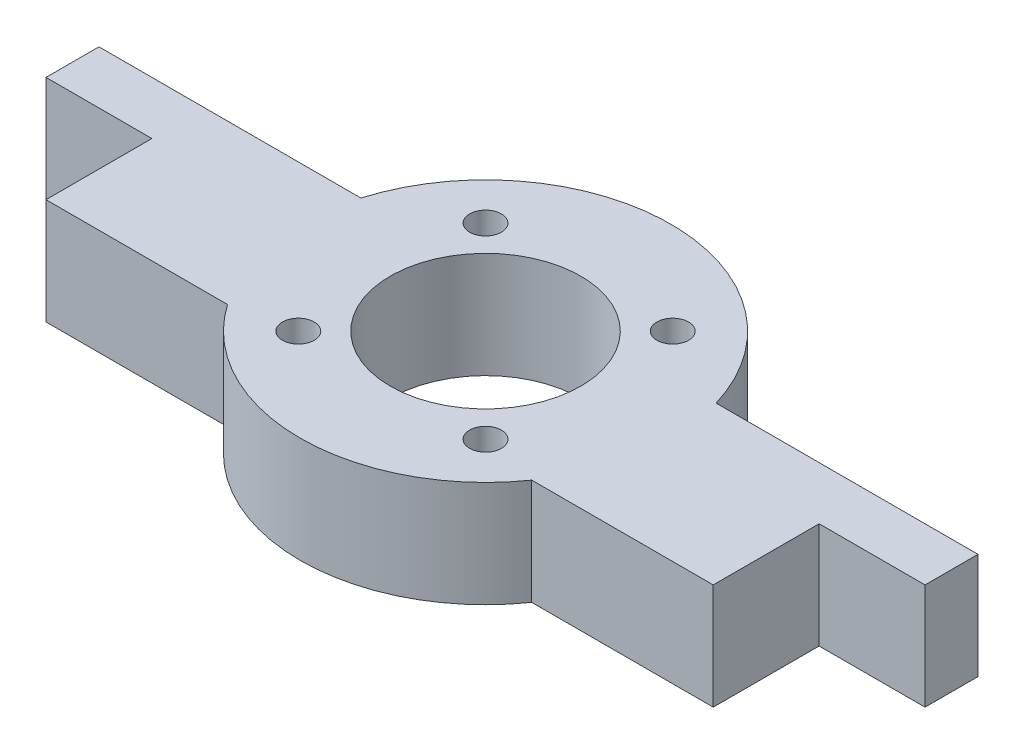
ISO-10303-21;
HEADER;
FILE_DESCRIPTION(('STEP AP214'),'2;1');
FILE_NAME('part.step','',(''),(''),'','','');
FILE_SCHEMA(('AUTOMOTIVE_DESIGN { 1 0 10303 214 1 1 1 1 }'));
ENDSEC;
DATA;
#1=APPLICATION_CONTEXT('core data for automotive mechanical design processes');
#2=APPLICATION_PROTOCOL_DEFINITION('international standard','automotive_design',2000,#1);
#3=PRODUCT_CONTEXT('',#1,'mechanical');
#4=PRODUCT('Part','Part','',(#3));
#5=PRODUCT_RELATED_PRODUCT_CATEGORY('part','',(#4));
#6=PRODUCT_DEFINITION_FORMATION('','',#4);
#7=PRODUCT_DEFINITION_CONTEXT('part definition',#1,'design');
#8=PRODUCT_DEFINITION('design','',#6,#7);
#9=PRODUCT_DEFINITION_SHAPE('','',#8);
#10=(LENGTH_UNIT() NAMED_UNIT(*) SI_UNIT(.MILLI.,.METRE.));
#11=(NAMED_UNIT(*) PLANE_ANGLE_UNIT() SI_UNIT($,.RADIAN.));
#12=(NAMED_UNIT(*) SI_UNIT($,.STERADIAN.) SOLID_ANGLE_UNIT());
#13=UNCERTAINTY_MEASURE_WITH_UNIT(LENGTH_MEASURE(1.E-05),#10,'distance_accuracy_value','');
#14=(GEOMETRIC_REPRESENTATION_CONTEXT(3) GLOBAL_UNCERTAINTY_ASSIGNED_CONTEXT((#13)) GLOBAL_UNIT_ASSIGNED_CONTEXT((#10,
#11,#12)) REPRESENTATION_CONTEXT('',''));
#15=CARTESIAN_POINT('',(0.,0.,0.));
#16=DIRECTION('',(0.,0.,1.));
#17=DIRECTION('',(1.,0.,0.));
#18=AXIS2_PLACEMENT_3D('',#15,#16,#17);
#19=CARTESIAN_POINT('',(0.,10.,0.));
#20=DIRECTION('',(0.,1.,0.));
#21=DIRECTION('',(0.,0.,1.));
#22=AXIS2_PLACEMENT_3D('',#19,#20,#21);
#23=PLANE('',#22);
#24=CARTESIAN_POINT('',(8.83883476483184,10.,8.83883476483184));
#25=DIRECTION('',(0.,1.,0.));
#26=DIRECTION('',(0.,0.,1.));
#27=AXIS2_PLACEMENT_3D('',#24,#25,#26);
#28=CIRCLE('',#27,1.5);
#29=CARTESIAN_POINT('',(8.83883476483184,10.,10.3388347648318));
#30=VERTEX_POINT('',#29);
#31=EDGE_CURVE('E340',#30,#30,#28,.T.);
#32=ORIENTED_EDGE('',*,*,#31,.F.);
#33=EDGE_LOOP('',(#32));
#34=FACE_BOUND('',#33,.T.);
#35=CARTESIAN_POINT('',(-8.83883476483184,10.,-8.83883476483184));
#36=DIRECTION('',(0.,1.,0.));
#37=DIRECTION('',(0.,0.,1.));
#38=AXIS2_PLACEMENT_3D('',#35,#36,#37);
#39=CIRCLE('',#38,1.5);
#40=CARTESIAN_POINT('',(-8.83883476483184,10.,-7.33883476483184));
#41=VERTEX_POINT('',#40);
#42=EDGE_CURVE('E356',#41,#41,#39,.T.);
#43=ORIENTED_EDGE('',*,*,#42,.F.);
#44=EDGE_LOOP('',(#43));
#45=FACE_BOUND('',#44,.T.);
#46=DIRECTION('',(1.,0.,0.));
#47=VECTOR('',#46,1.);
#48=CARTESIAN_POINT('',(-41.5,10.,0.));
#49=LINE('',#48,#47);
#50=CARTESIAN_POINT('',(-41.5,10.,0.));
#51=VERTEX_POINT('',#50);
#52=CARTESIAN_POINT('',(-31.5,10.,0.));
#53=VERTEX_POINT('',#52);
#54=EDGE_CURVE('E204',#51,#53,#49,.T.);
#55=ORIENTED_EDGE('',*,*,#54,.T.);
#56=DIRECTION('',(0.,0.,1.));
#57=VECTOR('',#56,1.);
#58=CARTESIAN_POINT('',(-31.5,10.,0.));
#59=LINE('',#58,#57);
#60=CARTESIAN_POINT('',(-31.5,10.,10.));
#61=VERTEX_POINT('',#60);
#62=EDGE_CURVE('E116',#53,#61,#59,.T.);
#63=ORIENTED_EDGE('',*,*,#62,.T.);
#64=DIRECTION('',(1.,0.,0.));
#65=VECTOR('',#64,1.);
#66=CARTESIAN_POINT('',(-31.5,10.,10.));
#67=LINE('',#66,#65);
#68=CARTESIAN_POINT('',(-14.3614066163451,10.,10.));
#69=VERTEX_POINT('',#68);
#70=EDGE_CURVE('E241',#61,#69,#67,.T.);
#71=ORIENTED_EDGE('',*,*,#70,.T.);
#72=CARTESIAN_POINT('',(0.,10.,0.));
#73=DIRECTION('',(0.,1.,0.));
#74=DIRECTION('',(0.,0.,1.));
#75=AXIS2_PLACEMENT_3D('',#72,#73,#74);
#76=CIRCLE('',#75,17.5);
#77=CARTESIAN_POINT('',(14.3614066163451,10.,10.));
#78=VERTEX_POINT('',#77);
#79=EDGE_CURVE('E261',#69,#78,#76,.T.);
#80=ORIENTED_EDGE('',*,*,#79,.T.);
#81=DIRECTION('',(1.,0.,0.));
#82=VECTOR('',#81,1.);
#83=CARTESIAN_POINT('',(14.3614066163451,10.,10.));
#84=LINE('',#83,#82);
#85=CARTESIAN_POINT('',(31.5,10.,10.));
#86=VERTEX_POINT('',#85);
#87=EDGE_CURVE('E257',#78,#86,#84,.T.);
#88=ORIENTED_EDGE('',*,*,#87,.T.);
#89=DIRECTION('',(0.,0.,-1.));
#90=VECTOR('',#89,1.);
#91=CARTESIAN_POINT('',(31.5,10.,0.));
#92=LINE('',#91,#90);
#93=CARTESIAN_POINT('',(31.5,10.,0.));
#94=VERTEX_POINT('',#93);
#95=EDGE_CURVE('E260',#86,#94,#92,.T.);
#96=ORIENTED_EDGE('',*,*,#95,.T.);
#97=DIRECTION('',(1.,0.,0.));
#98=VECTOR('',#97,1.);
#99=CARTESIAN_POINT('',(41.5,10.,0.));
#100=LINE('',#99,#98);
#101=CARTESIAN_POINT('',(41.5,10.,0.));
#102=VERTEX_POINT('',#101);
#103=EDGE_CURVE('E265',#94,#102,#100,.T.);
#104=ORIENTED_EDGE('',*,*,#103,.T.);
#105=DIRECTION('',(0.,0.,-1.));
#106=VECTOR('',#105,1.);
#107=CARTESIAN_POINT('',(41.5,10.,-5.));
#108=LINE('',#107,#106);
#109=CARTESIAN_POINT('',(41.5,10.,-5.));
#110=VERTEX_POINT('',#109);
#111=EDGE_CURVE('E272',#102,#110,#108,.T.);
#112=ORIENTED_EDGE('',*,*,#111,.T.);
#113=DIRECTION('',(-1.,0.,0.));
#114=VECTOR('',#113,1.);
#115=CARTESIAN_POINT('',(16.7705098312484,10.,-5.));
#116=LINE('',#115,#114);
#117=CARTESIAN_POINT('',(16.7705098312484,10.,-5.));
#118=VERTEX_POINT('',#117);
#119=EDGE_CURVE('E147',#110,#118,#116,.T.);
#120=ORIENTED_EDGE('',*,*,#119,.T.);
#121=CARTESIAN_POINT('',(0.,10.,0.));
#122=DIRECTION('',(0.,1.,0.));
#123=DIRECTION('',(0.,0.,1.));
#124=AXIS2_PLACEMENT_3D('',#121,#122,#123);
#125=CIRCLE('',#124,17.5);
#126=CARTESIAN_POINT('',(-16.7705098312484,10.,-5.00000000000001));
#127=VERTEX_POINT('',#126);
#128=EDGE_CURVE('E141',#118,#127,#125,.T.);
#129=ORIENTED_EDGE('',*,*,#128,.T.);
#130=DIRECTION('',(-1.,0.,0.));
#131=VECTOR('',#130,1.);
#132=CARTESIAN_POINT('',(-41.5,10.,-5.));
#133=LINE('',#132,#131);
#134=CARTESIAN_POINT('',(-41.5,10.,-5.));
#135=VERTEX_POINT('',#134);
#136=EDGE_CURVE('E145',#127,#135,#133,.T.);
#137=ORIENTED_EDGE('',*,*,#136,.T.);
#138=DIRECTION('',(0.,0.,1.));
#139=VECTOR('',#138,1.);
#140=CARTESIAN_POINT('',(-41.5,10.,-5.));
#141=LINE('',#140,#139);
#142=EDGE_CURVE('E61',#135,#51,#141,.T.);
#143=ORIENTED_EDGE('',*,*,#142,.T.);
#144=EDGE_LOOP('',(#55,#63,#71,#80,#88,#96,#104,#112,#120,#129,#137,#143));
#145=FACE_BOUND('',#144,.T.);
#146=CARTESIAN_POINT('',(0.,10.,0.));
#147=DIRECTION('',(0.,1.,0.));
#148=DIRECTION('',(0.,0.,1.));
#149=AXIS2_PLACEMENT_3D('',#146,#147,#148);
#150=CIRCLE('',#149,9.);
#151=CARTESIAN_POINT('',(0.,10.,9.));
#152=VERTEX_POINT('',#151);
#153=EDGE_CURVE('E174',#152,#152,#150,.T.);
#154=ORIENTED_EDGE('',*,*,#153,.F.);
#155=EDGE_LOOP('',(#154));
#156=FACE_BOUND('',#155,.T.);
#157=CARTESIAN_POINT('',(8.83883476483184,10.,-8.83883476483185));
#158=DIRECTION('',(0.,1.,0.));
#159=DIRECTION('',(0.,0.,1.));
#160=AXIS2_PLACEMENT_3D('',#157,#158,#159);
#161=CIRCLE('',#160,1.5);
#162=CARTESIAN_POINT('',(8.83883476483184,10.,-7.33883476483185));
#163=VERTEX_POINT('',#162);
#164=EDGE_CURVE('E348',#163,#163,#161,.T.);
#165=ORIENTED_EDGE('',*,*,#164,.F.);
#166=EDGE_LOOP('',(#165));
#167=FACE_BOUND('',#166,.T.);
#168=CARTESIAN_POINT('',(-8.83883476483184,10.,8.83883476483185));
#169=DIRECTION('',(0.,1.,0.));
#170=DIRECTION('',(0.,0.,1.));
#171=AXIS2_PLACEMENT_3D('',#168,#169,#170);
#172=CIRCLE('',#171,1.5);
#173=CARTESIAN_POINT('',(-8.83883476483184,10.,10.3388347648318));
#174=VERTEX_POINT('',#173);
#175=EDGE_CURVE('E329',#174,#174,#172,.T.);
#176=ORIENTED_EDGE('',*,*,#175,.F.);
#177=EDGE_LOOP('',(#176));
#178=FACE_BOUND('',#177,.T.);
#179=ADVANCED_FACE('F43',(#34,#45,#145,#156,#167,#178),#23,.T.);
#180=CARTESIAN_POINT('',(0.,0.,0.));
#181=DIRECTION('',(0.,1.,0.));
#182=DIRECTION('',(0.,0.,1.));
#183=AXIS2_PLACEMENT_3D('',#180,#181,#182);
#184=PLANE('',#183);
#185=DIRECTION('',(1.,0.,0.));
#186=VECTOR('',#185,1.);
#187=CARTESIAN_POINT('',(-41.5,0.,0.));
#188=LINE('',#187,#186);
#189=CARTESIAN_POINT('',(-41.5,0.,0.));
#190=VERTEX_POINT('',#189);
#191=CARTESIAN_POINT('',(-31.5,0.,0.));
#192=VERTEX_POINT('',#191);
#193=EDGE_CURVE('E169',#190,#192,#188,.T.);
#194=ORIENTED_EDGE('',*,*,#193,.F.);
#195=DIRECTION('',(0.,0.,1.));
#196=VECTOR('',#195,1.);
#197=CARTESIAN_POINT('',(-41.5,0.,-5.));
#198=LINE('',#197,#196);
#199=CARTESIAN_POINT('',(-41.5,0.,-5.));
#200=VERTEX_POINT('',#199);
#201=EDGE_CURVE('E108',#200,#190,#198,.T.);
#202=ORIENTED_EDGE('',*,*,#201,.F.);
#203=DIRECTION('',(-1.,0.,0.));
#204=VECTOR('',#203,1.);
#205=CARTESIAN_POINT('',(-41.5,0.,-5.));
#206=LINE('',#205,#204);
#207=CARTESIAN_POINT('',(-16.7705098312484,0.,-5.00000000000001));
#208=VERTEX_POINT('',#207);
#209=EDGE_CURVE('E102',#208,#200,#206,.T.);
#210=ORIENTED_EDGE('',*,*,#209,.F.);
#211=CARTESIAN_POINT('',(0.,0.,0.));
#212=DIRECTION('',(0.,1.,0.));
#213=DIRECTION('',(0.,0.,1.));
#214=AXIS2_PLACEMENT_3D('',#211,#212,#213);
#215=CIRCLE('',#214,17.5);
#216=CARTESIAN_POINT('',(16.7705098312484,0.,-5.));
#217=VERTEX_POINT('',#216);
#218=EDGE_CURVE('E156',#217,#208,#215,.T.);
#219=ORIENTED_EDGE('',*,*,#218,.F.);
#220=DIRECTION('',(-1.,0.,0.));
#221=VECTOR('',#220,1.);
#222=CARTESIAN_POINT('',(16.7705098312484,0.,-5.));
#223=LINE('',#222,#221);
#224=CARTESIAN_POINT('',(41.5,0.,-5.));
#225=VERTEX_POINT('',#224);
#226=EDGE_CURVE('E195',#225,#217,#223,.T.);
#227=ORIENTED_EDGE('',*,*,#226,.F.);
#228=DIRECTION('',(0.,0.,-1.));
#229=VECTOR('',#228,1.);
#230=CARTESIAN_POINT('',(41.5,0.,-5.));
#231=LINE('',#230,#229);
#232=CARTESIAN_POINT('',(41.5,0.,0.));
#233=VERTEX_POINT('',#232);
#234=EDGE_CURVE('E192',#233,#225,#231,.T.);
#235=ORIENTED_EDGE('',*,*,#234,.F.);
#236=DIRECTION('',(1.,0.,0.));
#237=VECTOR('',#236,1.);
#238=CARTESIAN_POINT('',(41.5,0.,0.));
#239=LINE('',#238,#237);
#240=CARTESIAN_POINT('',(31.5,0.,0.));
#241=VERTEX_POINT('',#240);
#242=EDGE_CURVE('E189',#241,#233,#239,.T.);
#243=ORIENTED_EDGE('',*,*,#242,.F.);
#244=DIRECTION('',(0.,0.,-1.));
#245=VECTOR('',#244,1.);
#246=CARTESIAN_POINT('',(31.5,0.,0.));
#247=LINE('',#246,#245);
#248=CARTESIAN_POINT('',(31.5,0.,10.));
#249=VERTEX_POINT('',#248);
#250=EDGE_CURVE('E186',#249,#241,#247,.T.);
#251=ORIENTED_EDGE('',*,*,#250,.F.);
#252=DIRECTION('',(1.,0.,0.));
#253=VECTOR('',#252,1.);
#254=CARTESIAN_POINT('',(14.3614066163451,0.,10.));
#255=LINE('',#254,#253);
#256=CARTESIAN_POINT('',(14.3614066163451,0.,10.));
#257=VERTEX_POINT('',#256);
#258=EDGE_CURVE('E183',#257,#249,#255,.T.);
#259=ORIENTED_EDGE('',*,*,#258,.F.);
#260=CARTESIAN_POINT('',(0.,0.,0.));
#261=DIRECTION('',(0.,1.,0.));
#262=DIRECTION('',(0.,0.,1.));
#263=AXIS2_PLACEMENT_3D('',#260,#261,#262);
#264=CIRCLE('',#263,17.5);
#265=CARTESIAN_POINT('',(-14.3614066163451,0.,10.));
#266=VERTEX_POINT('',#265);
#267=EDGE_CURVE('E180',#266,#257,#264,.T.);
#268=ORIENTED_EDGE('',*,*,#267,.F.);
#269=DIRECTION('',(1.,0.,0.));
#270=VECTOR('',#269,1.);
#271=CARTESIAN_POINT('',(-31.5,0.,10.));
#272=LINE('',#271,#270);
#273=CARTESIAN_POINT('',(-31.5,0.,10.));
#274=VERTEX_POINT('',#273);
#275=EDGE_CURVE('E177',#274,#266,#272,.T.);
#276=ORIENTED_EDGE('',*,*,#275,.F.);
#277=DIRECTION('',(0.,0.,1.));
#278=VECTOR('',#277,1.);
#279=CARTESIAN_POINT('',(-31.5,0.,0.));
#280=LINE('',#279,#278);
#281=EDGE_CURVE('E173',#192,#274,#280,.T.);
#282=ORIENTED_EDGE('',*,*,#281,.F.);
#283=EDGE_LOOP('',(#194,#202,#210,#219,#227,#235,#243,#251,#259,#268,#276,#282));
#284=FACE_BOUND('',#283,.T.);
#285=CARTESIAN_POINT('',(0.,0.,0.));
#286=DIRECTION('',(0.,1.,0.));
#287=DIRECTION('',(0.,0.,1.));
#288=AXIS2_PLACEMENT_3D('',#285,#286,#287);
#289=CIRCLE('',#288,9.);
#290=CARTESIAN_POINT('',(0.,0.,9.));
#291=VERTEX_POINT('',#290);
#292=EDGE_CURVE('E360',#291,#291,#289,.T.);
#293=ORIENTED_EDGE('',*,*,#292,.T.);
#294=EDGE_LOOP('',(#293));
#295=FACE_BOUND('',#294,.T.);
#296=CARTESIAN_POINT('',(-8.83883476483184,0.,-8.83883476483184));
#297=DIRECTION('',(0.,1.,0.));
#298=DIRECTION('',(0.,0.,1.));
#299=AXIS2_PLACEMENT_3D('',#296,#297,#298);
#300=CIRCLE('',#299,1.5);
#301=CARTESIAN_POINT('',(-8.83883476483184,0.,-7.33883476483184));
#302=VERTEX_POINT('',#301);
#303=EDGE_CURVE('E352',#302,#302,#300,.T.);
#304=ORIENTED_EDGE('',*,*,#303,.T.);
#305=EDGE_LOOP('',(#304));
#306=FACE_BOUND('',#305,.T.);
#307=CARTESIAN_POINT('',(8.83883476483184,0.,-8.83883476483185));
#308=DIRECTION('',(0.,1.,0.));
#309=DIRECTION('',(0.,0.,1.));
#310=AXIS2_PLACEMENT_3D('',#307,#308,#309);
#311=CIRCLE('',#310,1.5);
#312=CARTESIAN_POINT('',(8.83883476483184,0.,-7.33883476483185));
#313=VERTEX_POINT('',#312);
#314=EDGE_CURVE('E344',#313,#313,#311,.T.);
#315=ORIENTED_EDGE('',*,*,#314,.T.);
#316=EDGE_LOOP('',(#315));
#317=FACE_BOUND('',#316,.T.);
#318=CARTESIAN_POINT('',(8.83883476483184,0.,8.83883476483184));
#319=DIRECTION('',(0.,1.,0.));
#320=DIRECTION('',(0.,0.,1.));
#321=AXIS2_PLACEMENT_3D('',#318,#319,#320);
#322=CIRCLE('',#321,1.5);
#323=CARTESIAN_POINT('',(8.83883476483184,0.,10.3388347648318));
#324=VERTEX_POINT('',#323);
#325=EDGE_CURVE('E337',#324,#324,#322,.T.);
#326=ORIENTED_EDGE('',*,*,#325,.T.);
#327=EDGE_LOOP('',(#326));
#328=FACE_BOUND('',#327,.T.);
#329=CARTESIAN_POINT('',(-8.83883476483184,0.,8.83883476483185));
#330=DIRECTION('',(0.,1.,0.));
#331=DIRECTION('',(0.,0.,1.));
#332=AXIS2_PLACEMENT_3D('',#329,#330,#331);
#333=CIRCLE('',#332,1.5);
#334=CARTESIAN_POINT('',(-8.83883476483184,0.,10.3388347648318));
#335=VERTEX_POINT('',#334);
#336=EDGE_CURVE('E332',#335,#335,#333,.T.);
#337=ORIENTED_EDGE('',*,*,#336,.T.);
#338=EDGE_LOOP('',(#337));
#339=FACE_BOUND('',#338,.T.);
#340=ADVANCED_FACE('F245',(#284,#295,#306,#317,#328,#339),#184,.F.);
#341=CARTESIAN_POINT('',(-41.5,10.,0.));
#342=DIRECTION('',(0.,0.,-1.));
#343=DIRECTION('',(-1.,0.,0.));
#344=AXIS2_PLACEMENT_3D('',#341,#342,#343);
#345=PLANE('',#344);
#346=ORIENTED_EDGE('',*,*,#193,.T.);
#347=DIRECTION('',(0.,-1.,0.));
#348=VECTOR('',#347,1.);
#349=CARTESIAN_POINT('',(-31.5,10.,0.));
#350=LINE('',#349,#348);
#351=EDGE_CURVE('E11',#53,#192,#350,.T.);
#352=ORIENTED_EDGE('',*,*,#351,.F.);
#353=ORIENTED_EDGE('',*,*,#54,.F.);
#354=DIRECTION('',(0.,-1.,0.));
#355=VECTOR('',#354,1.);
#356=CARTESIAN_POINT('',(-41.5,10.,0.));
#357=LINE('',#356,#355);
#358=EDGE_CURVE('E165',#51,#190,#357,.T.);
#359=ORIENTED_EDGE('',*,*,#358,.T.);
#360=EDGE_LOOP('',(#346,#352,#353,#359));
#361=FACE_BOUND('',#360,.T.);
#362=ADVANCED_FACE('F45',(#361),#345,.F.);
#363=CARTESIAN_POINT('',(-31.5,10.,0.));
#364=DIRECTION('',(1.,0.,0.));
#365=DIRECTION('',(0.,0.,-1.));
#366=AXIS2_PLACEMENT_3D('',#363,#364,#365);
#367=PLANE('',#366);
#368=ORIENTED_EDGE('',*,*,#281,.T.);
#369=DIRECTION('',(0.,-1.,0.));
#370=VECTOR('',#369,1.);
#371=CARTESIAN_POINT('',(-31.5,10.,10.));
#372=LINE('',#371,#370);
#373=EDGE_CURVE('E53',#61,#274,#372,.T.);
#374=ORIENTED_EDGE('',*,*,#373,.F.);
#375=ORIENTED_EDGE('',*,*,#62,.F.);
#376=ORIENTED_EDGE('',*,*,#351,.T.);
#377=EDGE_LOOP('',(#368,#374,#375,#376));
#378=FACE_BOUND('',#377,.T.);
#379=ADVANCED_FACE('F495',(#378),#367,.F.);
#380=CARTESIAN_POINT('',(-31.5,10.,10.));
#381=DIRECTION('',(0.,0.,-1.));
#382=DIRECTION('',(-1.,0.,0.));
#383=AXIS2_PLACEMENT_3D('',#380,#381,#382);
#384=PLANE('',#383);
#385=ORIENTED_EDGE('',*,*,#275,.T.);
#386=DIRECTION('',(0.,-1.,0.));
#387=VECTOR('',#386,1.);
#388=CARTESIAN_POINT('',(-14.3614066163451,10.,10.));
#389=LINE('',#388,#387);
#390=EDGE_CURVE('E231',#69,#266,#389,.T.);
#391=ORIENTED_EDGE('',*,*,#390,.F.);
#392=ORIENTED_EDGE('',*,*,#70,.F.);
#393=ORIENTED_EDGE('',*,*,#373,.T.);
#394=EDGE_LOOP('',(#385,#391,#392,#393));
#395=FACE_BOUND('',#394,.T.);
#396=ADVANCED_FACE('F239',(#395),#384,.F.);
#397=CARTESIAN_POINT('',(0.,10.,0.));
#398=DIRECTION('',(0.,-1.,0.));
#399=DIRECTION('',(0.,0.,-1.));
#400=AXIS2_PLACEMENT_3D('',#397,#398,#399);
#401=CYLINDRICAL_SURFACE('',#400,17.5);
#402=ORIENTED_EDGE('',*,*,#267,.T.);
#403=DIRECTION('',(0.,-1.,0.));
#404=VECTOR('',#403,1.);
#405=CARTESIAN_POINT('',(14.3614066163451,10.,10.));
#406=LINE('',#405,#404);
#407=EDGE_CURVE('E227',#78,#257,#406,.T.);
#408=ORIENTED_EDGE('',*,*,#407,.F.);
#409=ORIENTED_EDGE('',*,*,#79,.F.);
#410=ORIENTED_EDGE('',*,*,#390,.T.);
#411=EDGE_LOOP('',(#402,#408,#409,#410));
#412=FACE_BOUND('',#411,.T.);
#413=ADVANCED_FACE('F251',(#412),#401,.T.);
#414=CARTESIAN_POINT('',(14.3614066163451,10.,10.));
#415=DIRECTION('',(0.,0.,-1.));
#416=DIRECTION('',(-1.,0.,0.));
#417=AXIS2_PLACEMENT_3D('',#414,#415,#416);
#418=PLANE('',#417);
#419=ORIENTED_EDGE('',*,*,#258,.T.);
#420=DIRECTION('',(0.,-1.,0.));
#421=VECTOR('',#420,1.);
#422=CARTESIAN_POINT('',(31.5,10.,10.));
#423=LINE('',#422,#421);
#424=EDGE_CURVE('E223',#86,#249,#423,.T.);
#425=ORIENTED_EDGE('',*,*,#424,.F.);
#426=ORIENTED_EDGE('',*,*,#87,.F.);
#427=ORIENTED_EDGE('',*,*,#407,.T.);
#428=EDGE_LOOP('',(#419,#425,#426,#427));
#429=FACE_BOUND('',#428,.T.);
#430=ADVANCED_FACE('F255',(#429),#418,.F.);
#431=CARTESIAN_POINT('',(31.5,10.,0.));
#432=DIRECTION('',(-1.,0.,0.));
#433=DIRECTION('',(0.,0.,1.));
#434=AXIS2_PLACEMENT_3D('',#431,#432,#433);
#435=PLANE('',#434);
#436=ORIENTED_EDGE('',*,*,#250,.T.);
#437=DIRECTION('',(0.,-1.,0.));
#438=VECTOR('',#437,1.);
#439=CARTESIAN_POINT('',(31.5,10.,0.));
#440=LINE('',#439,#438);
#441=EDGE_CURVE('E219',#94,#241,#440,.T.);
#442=ORIENTED_EDGE('',*,*,#441,.F.);
#443=ORIENTED_EDGE('',*,*,#95,.F.);
#444=ORIENTED_EDGE('',*,*,#424,.T.);
#445=EDGE_LOOP('',(#436,#442,#443,#444));
#446=FACE_BOUND('',#445,.T.);
#447=ADVANCED_FACE('F456',(#446),#435,.F.);
#448=CARTESIAN_POINT('',(41.5,10.,0.));
#449=DIRECTION('',(0.,0.,-1.));
#450=DIRECTION('',(-1.,0.,0.));
#451=AXIS2_PLACEMENT_3D('',#448,#449,#450);
#452=PLANE('',#451);
#453=ORIENTED_EDGE('',*,*,#242,.T.);
#454=DIRECTION('',(0.,-1.,0.));
#455=VECTOR('',#454,1.);
#456=CARTESIAN_POINT('',(41.5,10.,0.));
#457=LINE('',#456,#455);
#458=EDGE_CURVE('E215',#102,#233,#457,.T.);
#459=ORIENTED_EDGE('',*,*,#458,.F.);
#460=ORIENTED_EDGE('',*,*,#103,.F.);
#461=ORIENTED_EDGE('',*,*,#441,.T.);
#462=EDGE_LOOP('',(#453,#459,#460,#461));
#463=FACE_BOUND('',#462,.T.);
#464=ADVANCED_FACE('F446',(#463),#452,.F.);
#465=CARTESIAN_POINT('',(41.5,10.,-5.));
#466=DIRECTION('',(-1.,0.,0.));
#467=DIRECTION('',(0.,0.,1.));
#468=AXIS2_PLACEMENT_3D('',#465,#466,#467);
#469=PLANE('',#468);
#470=ORIENTED_EDGE('',*,*,#234,.T.);
#471=DIRECTION('',(0.,-1.,0.));
#472=VECTOR('',#471,1.);
#473=CARTESIAN_POINT('',(41.5,10.,-5.));
#474=LINE('',#473,#472);
#475=EDGE_CURVE('E211',#110,#225,#474,.T.);
#476=ORIENTED_EDGE('',*,*,#475,.F.);
#477=ORIENTED_EDGE('',*,*,#111,.F.);
#478=ORIENTED_EDGE('',*,*,#458,.T.);
#479=EDGE_LOOP('',(#470,#476,#477,#478));
#480=FACE_BOUND('',#479,.T.);
#481=ADVANCED_FACE('F280',(#480),#469,.F.);
#482=CARTESIAN_POINT('',(16.7705098312484,10.,-5.));
#483=DIRECTION('',(0.,0.,1.));
#484=DIRECTION('',(1.,0.,0.));
#485=AXIS2_PLACEMENT_3D('',#482,#483,#484);
#486=PLANE('',#485);
#487=ORIENTED_EDGE('',*,*,#226,.T.);
#488=DIRECTION('',(0.,-1.,0.));
#489=VECTOR('',#488,1.);
#490=CARTESIAN_POINT('',(16.7705098312484,10.,-5.));
#491=LINE('',#490,#489);
#492=EDGE_CURVE('E158',#118,#217,#491,.T.);
#493=ORIENTED_EDGE('',*,*,#492,.F.);
#494=ORIENTED_EDGE('',*,*,#119,.F.);
#495=ORIENTED_EDGE('',*,*,#475,.T.);
#496=EDGE_LOOP('',(#487,#493,#494,#495));
#497=FACE_BOUND('',#496,.T.);
#498=ADVANCED_FACE('F284',(#497),#486,.F.);
#499=CARTESIAN_POINT('',(0.,10.,0.));
#500=DIRECTION('',(0.,-1.,0.));
#501=DIRECTION('',(0.,0.,-1.));
#502=AXIS2_PLACEMENT_3D('',#499,#500,#501);
#503=CYLINDRICAL_SURFACE('',#502,17.5);
#504=ORIENTED_EDGE('',*,*,#218,.T.);
#505=DIRECTION('',(0.,-1.,0.));
#506=VECTOR('',#505,1.);
#507=CARTESIAN_POINT('',(-16.7705098312484,10.,-5.00000000000001));
#508=LINE('',#507,#506);
#509=EDGE_CURVE('E153',#127,#208,#508,.T.);
#510=ORIENTED_EDGE('',*,*,#509,.F.);
#511=ORIENTED_EDGE('',*,*,#128,.F.);
#512=ORIENTED_EDGE('',*,*,#492,.T.);
#513=EDGE_LOOP('',(#504,#510,#511,#512));
#514=FACE_BOUND('',#513,.T.);
#515=ADVANCED_FACE('F154',(#514),#503,.T.);
#516=CARTESIAN_POINT('',(-41.5,10.,-5.));
#517=DIRECTION('',(0.,0.,1.));
#518=DIRECTION('',(1.,0.,0.));
#519=AXIS2_PLACEMENT_3D('',#516,#517,#518);
#520=PLANE('',#519);
#521=ORIENTED_EDGE('',*,*,#209,.T.);
#522=DIRECTION('',(0.,-1.,0.));
#523=VECTOR('',#522,1.);
#524=CARTESIAN_POINT('',(-41.5,10.,-5.));
#525=LINE('',#524,#523);
#526=EDGE_CURVE('E159',#135,#200,#525,.T.);
#527=ORIENTED_EDGE('',*,*,#526,.F.);
#528=ORIENTED_EDGE('',*,*,#136,.F.);
#529=ORIENTED_EDGE('',*,*,#509,.T.);
#530=EDGE_LOOP('',(#521,#527,#528,#529));
#531=FACE_BOUND('',#530,.T.);
#532=ADVANCED_FACE('F161',(#531),#520,.F.);
#533=CARTESIAN_POINT('',(-41.5,10.,-5.));
#534=DIRECTION('',(1.,0.,0.));
#535=DIRECTION('',(0.,0.,-1.));
#536=AXIS2_PLACEMENT_3D('',#533,#534,#535);
#537=PLANE('',#536);
#538=ORIENTED_EDGE('',*,*,#201,.T.);
#539=ORIENTED_EDGE('',*,*,#358,.F.);
#540=ORIENTED_EDGE('',*,*,#142,.F.);
#541=ORIENTED_EDGE('',*,*,#526,.T.);
#542=EDGE_LOOP('',(#538,#539,#540,#541));
#543=FACE_BOUND('',#542,.T.);
#544=ADVANCED_FACE('F288',(#543),#537,.F.);
#545=CARTESIAN_POINT('',(0.,10.,0.));
#546=DIRECTION('',(0.,-1.,0.));
#547=DIRECTION('',(0.,0.,-1.));
#548=AXIS2_PLACEMENT_3D('',#545,#546,#547);
#549=CYLINDRICAL_SURFACE('',#548,9.);
#550=ORIENTED_EDGE('',*,*,#153,.T.);
#551=EDGE_LOOP('',(#550));
#552=FACE_BOUND('',#551,.T.);
#553=ORIENTED_EDGE('',*,*,#292,.F.);
#554=EDGE_LOOP('',(#553));
#555=FACE_BOUND('',#554,.T.);
#556=ADVANCED_FACE('F290',(#552,#555),#549,.F.);
#557=CARTESIAN_POINT('',(-8.83883476483184,10.,-8.83883476483184));
#558=DIRECTION('',(0.,-1.,0.));
#559=DIRECTION('',(0.,0.,-1.));
#560=AXIS2_PLACEMENT_3D('',#557,#558,#559);
#561=CYLINDRICAL_SURFACE('',#560,1.5);
#562=ORIENTED_EDGE('',*,*,#42,.T.);
#563=EDGE_LOOP('',(#562));
#564=FACE_BOUND('',#563,.T.);
#565=ORIENTED_EDGE('',*,*,#303,.F.);
#566=EDGE_LOOP('',(#565));
#567=FACE_BOUND('',#566,.T.);
#568=ADVANCED_FACE('F296',(#564,#567),#561,.F.);
#569=CARTESIAN_POINT('',(8.83883476483184,10.,-8.83883476483185));
#570=DIRECTION('',(0.,-1.,0.));
#571=DIRECTION('',(0.,0.,-1.));
#572=AXIS2_PLACEMENT_3D('',#569,#570,#571);
#573=CYLINDRICAL_SURFACE('',#572,1.5);
#574=ORIENTED_EDGE('',*,*,#164,.T.);
#575=EDGE_LOOP('',(#574));
#576=FACE_BOUND('',#575,.T.);
#577=ORIENTED_EDGE('',*,*,#314,.F.);
#578=EDGE_LOOP('',(#577));
#579=FACE_BOUND('',#578,.T.);
#580=ADVANCED_FACE('F312',(#576,#579),#573,.F.);
#581=CARTESIAN_POINT('',(8.83883476483184,10.,8.83883476483184));
#582=DIRECTION('',(0.,-1.,0.));
#583=DIRECTION('',(0.,0.,-1.));
#584=AXIS2_PLACEMENT_3D('',#581,#582,#583);
#585=CYLINDRICAL_SURFACE('',#584,1.5);
#586=ORIENTED_EDGE('',*,*,#31,.T.);
#587=EDGE_LOOP('',(#586));
#588=FACE_BOUND('',#587,.T.);
#589=ORIENTED_EDGE('',*,*,#325,.F.);
#590=EDGE_LOOP('',(#589));
#591=FACE_BOUND('',#590,.T.);
#592=ADVANCED_FACE('F316',(#588,#591),#585,.F.);
#593=CARTESIAN_POINT('',(-8.83883476483184,10.,8.83883476483185));
#594=DIRECTION('',(0.,-1.,0.));
#595=DIRECTION('',(0.,0.,-1.));
#596=AXIS2_PLACEMENT_3D('',#593,#594,#595);
#597=CYLINDRICAL_SURFACE('',#596,1.5);
#598=ORIENTED_EDGE('',*,*,#175,.T.);
#599=EDGE_LOOP('',(#598));
#600=FACE_BOUND('',#599,.T.);
#601=ORIENTED_EDGE('',*,*,#336,.F.);
#602=EDGE_LOOP('',(#601));
#603=FACE_BOUND('',#602,.T.);
#604=ADVANCED_FACE('F320',(#600,#603),#597,.F.);
#605=CLOSED_SHELL('',(#179,#340,#362,#379,#396,#413,#430,#447,#464,#481,#498,#515,#532,#544,
#556,#568,#580,#592,#604));
#606=MANIFOLD_SOLID_BREP('B2',#605);
#607=ADVANCED_BREP_SHAPE_REPRESENTATION('',(#18,#606),#14);
#608=SHAPE_DEFINITION_REPRESENTATION(#9,#607);
ENDSEC;
END-ISO-10303-21;
